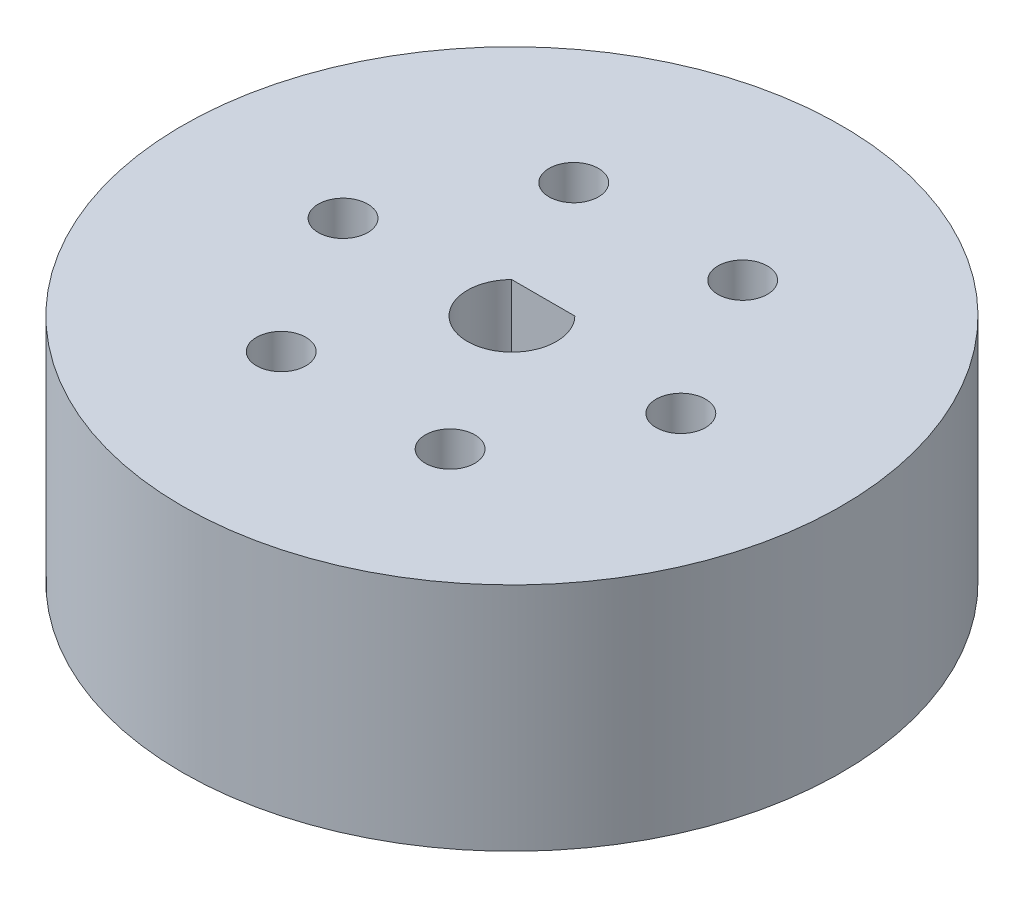
ISO-10303-21;
HEADER;
FILE_DESCRIPTION(('STEP AP214'),'2;1');
FILE_NAME('part.step','',(''),(''),'','','');
FILE_SCHEMA(('AUTOMOTIVE_DESIGN { 1 0 10303 214 1 1 1 1 }'));
ENDSEC;
DATA;
#1=APPLICATION_CONTEXT('core data for automotive mechanical design processes');
#2=APPLICATION_PROTOCOL_DEFINITION('international standard','automotive_design',2000,#1);
#3=PRODUCT_CONTEXT('',#1,'mechanical');
#4=PRODUCT('Part','Part','',(#3));
#5=PRODUCT_RELATED_PRODUCT_CATEGORY('part','',(#4));
#6=PRODUCT_DEFINITION_FORMATION('','',#4);
#7=PRODUCT_DEFINITION_CONTEXT('part definition',#1,'design');
#8=PRODUCT_DEFINITION('design','',#6,#7);
#9=PRODUCT_DEFINITION_SHAPE('','',#8);
#10=(LENGTH_UNIT() NAMED_UNIT(*) SI_UNIT(.MILLI.,.METRE.));
#11=(NAMED_UNIT(*) PLANE_ANGLE_UNIT() SI_UNIT($,.RADIAN.));
#12=(NAMED_UNIT(*) SI_UNIT($,.STERADIAN.) SOLID_ANGLE_UNIT());
#13=UNCERTAINTY_MEASURE_WITH_UNIT(LENGTH_MEASURE(1.E-05),#10,'distance_accuracy_value','');
#14=(GEOMETRIC_REPRESENTATION_CONTEXT(3) GLOBAL_UNCERTAINTY_ASSIGNED_CONTEXT((#13)) GLOBAL_UNIT_ASSIGNED_CONTEXT((#10,
#11,#12)) REPRESENTATION_CONTEXT('',''));
#15=CARTESIAN_POINT('',(0.,0.,0.));
#16=DIRECTION('',(0.,0.,1.));
#17=DIRECTION('',(1.,0.,0.));
#18=AXIS2_PLACEMENT_3D('',#15,#16,#17);
#19=CARTESIAN_POINT('',(0.0576965769122219,6.78723476658644,-19.9999167774521));
#20=DIRECTION('',(0.00288482884561109,0.,-0.999995838872608));
#21=DIRECTION('',(-0.999995838872608,0.,-0.00288482884561109));
#22=AXIS2_PLACEMENT_3D('',#19,#20,#21);
#23=CYLINDRICAL_SURFACE('',#22,1.2);
#24=CARTESIAN_POINT('',(0.00548119761462262,6.78723476658644,-1.9));
#25=DIRECTION('',(0.,0.,-1.));
#26=DIRECTION('',(1.,0.,0.));
#27=AXIS2_PLACEMENT_3D('',#24,#25,#26);
#28=ELLIPSE('',#27,1.20000499337364,1.2);
#29=CARTESIAN_POINT('',(1.20548619098827,6.78723476658644,-1.9));
#30=VERTEX_POINT('',#29);
#31=EDGE_CURVE('E90',#30,#30,#28,.T.);
#32=ORIENTED_EDGE('',*,*,#31,.F.);
#33=EDGE_LOOP('',(#32));
#34=FACE_BOUND('',#33,.T.);
#35=CARTESIAN_POINT('',(0.0493305732599497,6.78723476658644,-17.0999288447216));
#36=DIRECTION('',(0.00288482884561109,0.,-0.999995838872608));
#37=DIRECTION('',(-0.999995838872608,0.,-0.00288482884561109));
#38=AXIS2_PLACEMENT_3D('',#35,#36,#37);
#39=CIRCLE('',#38,1.2);
#40=CARTESIAN_POINT('',(-1.15066443338718,6.78723476658644,-17.1033906393363));
#41=VERTEX_POINT('',#40);
#42=EDGE_CURVE('E21',#41,#41,#39,.F.);
#43=ORIENTED_EDGE('',*,*,#42,.F.);
#44=EDGE_LOOP('',(#43));
#45=FACE_BOUND('',#44,.T.);
#46=ADVANCED_FACE('F16',(#34,#45),#23,.F.);
#47=CARTESIAN_POINT('',(0.,14.,0.));
#48=DIRECTION('',(0.,-1.,0.));
#49=DIRECTION('',(0.,0.,-1.));
#50=AXIS2_PLACEMENT_3D('',#47,#48,#49);
#51=CYLINDRICAL_SURFACE('',#50,20.);
#52=CARTESIAN_POINT('',(0.,8.98647806940963,-20.));
#53=CARTESIAN_POINT('',(-0.123176637815314,8.98324126856865,-19.9999984720124));
#54=CARTESIAN_POINT('',(-0.246161136773651,8.96962980992213,-19.9988500401782));
#55=CARTESIAN_POINT('',(-0.488170580767339,8.92201541306094,-19.9944088545781));
#56=CARTESIAN_POINT('',(-0.607191072317707,8.88799030547142,-19.9911137691959));
#57=CARTESIAN_POINT('',(-0.837741113813606,8.8005573294438,-19.9827798487453));
#58=CARTESIAN_POINT('',(-0.949275405178003,8.7471618692336,-19.9777421300658));
#59=CARTESIAN_POINT('',(-1.16178166002848,8.62252499791701,-19.9665120006754));
#60=CARTESIAN_POINT('',(-1.26275562933211,8.55128698456663,-19.9603198098679));
#61=CARTESIAN_POINT('',(-1.45173750911567,8.39265034647721,-19.9474679923171));
#62=CARTESIAN_POINT('',(-1.53969323348132,8.30518968509202,-19.940806634238));
#63=CARTESIAN_POINT('',(-1.69970397652202,8.11673749092767,-19.9278064057697));
#64=CARTESIAN_POINT('',(-1.77175828470953,8.01574535387562,-19.9214675498));
#65=CARTESIAN_POINT('',(-1.89805276035724,7.80283399716548,-19.9098327927493));
#66=CARTESIAN_POINT('',(-1.95225575014475,7.69089259486853,-19.9045390773718));
#67=CARTESIAN_POINT('',(-2.04106966132427,7.45942754987839,-19.8956286632006));
#68=CARTESIAN_POINT('',(-2.07568121200267,7.33990415085972,-19.8920119105428));
#69=CARTESIAN_POINT('',(-2.12418511044322,7.09723051434108,-19.8868910761321));
#70=CARTESIAN_POINT('',(-2.13816838461597,6.97409864796613,-19.8853777246145));
#71=CARTESIAN_POINT('',(-2.14529071340881,6.72722859001211,-19.8846106860781));
#72=CARTESIAN_POINT('',(-2.13843036834308,6.6034904159977,-19.885356933981));
#73=CARTESIAN_POINT('',(-2.10414065380669,6.35944407263588,-19.8890141003677));
#74=CARTESIAN_POINT('',(-2.07679441586095,6.23912407502109,-19.8919162697493));
#75=CARTESIAN_POINT('',(-2.002428574103,6.00478748846202,-19.8995393434844));
#76=CARTESIAN_POINT('',(-1.95540858881022,5.89077102179386,-19.9042602831043));
#77=CARTESIAN_POINT('',(-1.842892939196,5.67193340010251,-19.9149926662576));
#78=CARTESIAN_POINT('',(-1.77734826926518,5.56713761515502,-19.9210075225274));
#79=CARTESIAN_POINT('',(-1.62968741962193,5.36999443979788,-19.9336296960645));
#80=CARTESIAN_POINT('',(-1.54757066660879,5.27764748023185,-19.940237033824));
#81=CARTESIAN_POINT('',(-1.36858806031218,5.10752293923694,-19.9533215728868));
#82=CARTESIAN_POINT('',(-1.27164764646889,5.02982371139793,-19.9597979175918));
#83=CARTESIAN_POINT('',(-1.06605216755421,4.89179074208795,-19.9718331483426));
#84=CARTESIAN_POINT('',(-0.957397131568873,4.83145695750196,-19.9773920366664));
#85=CARTESIAN_POINT('',(-0.731471318351451,4.72990446203313,-19.9869386016669));
#86=CARTESIAN_POINT('',(-0.614203511575444,4.68867919634895,-19.9909268170614));
#87=CARTESIAN_POINT('',(-0.374358876645733,4.62652173046226,-19.9968556221667));
#88=CARTESIAN_POINT('',(-0.251782244621267,4.60558878124737,-19.9987962874551));
#89=CARTESIAN_POINT('',(-0.00549642226161848,4.5846911211898,-20.0003763056673));
#90=CARTESIAN_POINT('',(0.118203308739232,4.58461575072138,-20.0000278137824));
#91=CARTESIAN_POINT('',(0.363843166823541,4.60515759369319,-19.9970674706944));
#92=CARTESIAN_POINT('',(0.485783316608434,4.62577453992662,-19.9944556487185));
#93=CARTESIAN_POINT('',(0.724198831139169,4.68703212423651,-19.9872394531593));
#94=CARTESIAN_POINT('',(0.840684666693256,4.727632515295,-19.9826390867988));
#95=CARTESIAN_POINT('',(1.06519223783163,4.82766707807735,-19.9719305295676));
#96=CARTESIAN_POINT('',(1.17321372657139,4.88710179880929,-19.9658222947446));
#97=CARTESIAN_POINT('',(1.37824504006938,5.02342294847006,-19.9527204955877));
#98=CARTESIAN_POINT('',(1.47520450219815,5.10038475949606,-19.9457231665745));
#99=CARTESIAN_POINT('',(1.65486611286546,5.26945300034495,-19.9316220052691));
#100=CARTESIAN_POINT('',(1.73756785978576,5.36155985663809,-19.9245181699829));
#101=CARTESIAN_POINT('',(1.88670222011354,5.55875111552849,-19.9109517860557));
#102=CARTESIAN_POINT('',(1.95306804436796,5.66388623604518,-19.9044919322806));
#103=CARTESIAN_POINT('',(2.06719920762146,5.88388023172223,-19.8929634039619));
#104=CARTESIAN_POINT('',(2.11496491546465,5.99873891400737,-19.887894701832));
#105=CARTESIAN_POINT('',(2.19040806992656,6.23461125744848,-19.8797273468709));
#106=CARTESIAN_POINT('',(2.21813772259761,6.35560803726433,-19.8766235768373));
#107=CARTESIAN_POINT('',(2.25289355528498,6.60057447839338,-19.8727145225848));
#108=CARTESIAN_POINT('',(2.2599204422119,6.72454403805317,-19.8719091598853));
#109=CARTESIAN_POINT('',(2.25308180277748,6.97124746486024,-19.872685576501));
#110=CARTESIAN_POINT('',(2.23932510755617,7.09398440445057,-19.8742549209686));
#111=CARTESIAN_POINT('',(2.19152452999267,7.3353914710066,-19.8795822713429));
#112=CARTESIAN_POINT('',(2.15748055426112,7.45406157924861,-19.8833402873249));
#113=CARTESIAN_POINT('',(2.0700777625414,7.68403407868161,-19.8926292252966));
#114=CARTESIAN_POINT('',(2.01671185112524,7.79533374550528,-19.8981607984891));
#115=CARTESIAN_POINT('',(1.89218888758079,8.00741605877645,-19.9103872161883));
#116=CARTESIAN_POINT('',(1.82103179892871,8.10819868363276,-19.9170820630832));
#117=CARTESIAN_POINT('',(1.66249926336213,8.29695832206462,-19.9309418695528));
#118=CARTESIAN_POINT('',(1.57504028754395,8.38486502020656,-19.9381091215745));
#119=CARTESIAN_POINT('',(1.38657466018002,8.54479282572973,-19.9521006659551));
#120=CARTESIAN_POINT('',(1.28556483513483,8.61681020147998,-19.9589248774606));
#121=CARTESIAN_POINT('',(1.07258612974609,8.74304983314281,-19.971503670928));
#122=CARTESIAN_POINT('',(0.960590834432161,8.79722776105968,-19.9772555732418));
#123=CARTESIAN_POINT('',(0.729095364016713,8.8859276070843,-19.9870405005328));
#124=CARTESIAN_POINT('',(0.609603727649251,8.92047145378122,-19.9910754418497));
#125=CARTESIAN_POINT('',(0.407869124300898,8.96073067562828,-19.9960026474761));
#126=CARTESIAN_POINT('',(0.326752436999344,8.97225173144996,-19.997496778309));
#127=CARTESIAN_POINT('',(0.163728903167864,8.98620045171046,-19.9994959593343));
#128=CARTESIAN_POINT('',(0.0818220610052402,8.98862816638069,-20.0000010149903));
#129=CARTESIAN_POINT('',(0.,8.98647806940963,-20.));
#130=B_SPLINE_CURVE_WITH_KNOTS('',3,(#52,#53,#54,#55,#56,#57,#58,#59,#60,#61,#62,#63,#64,#65,
#66,#67,#68,#69,#70,#71,#72,#73,#74,#75,#76,#77,#78,#79,#80,#81,#82,#83,#84,#85,#86,#87,#88,#89,
#90,#91,#92,#93,#94,#95,#96,#97,#98,#99,#100,#101,#102,#103,#104,#105,#106,#107,#108,#109,#110,
#111,#112,#113,#114,#115,#116,#117,#118,#119,#120,#121,#122,#123,#124,#125,#126,#127,#128,#129),
.UNSPECIFIED.,.T.,.F.,(4,2,2,2,2,2,2,2,2,2,2,2,2,2,2,2,2,2,2,2,2,2,2,2,2,2,2,2,2,2,2,2,2,2,2,2,
2,2,4),(0.,0.369358399558057,0.739118653029371,1.10864246314059,1.47809595829202,
1.84899254269643,2.21990569569267,2.59158650899803,2.96325538306017,3.33328104884391,
3.70329605767084,4.0718176286514,4.44034634572002,4.80985925178704,5.17938494311059,
5.55083444656259,5.9222830277698,6.29360409638182,6.66491145859063,7.03424881621686,
7.40358140452763,7.77217317542836,8.14077569152068,8.51099451181307,8.88122375890573,
9.25294243695045,9.62465374336212,9.99539298944654,10.3661195762299,10.7349116074727,
11.1037053364059,11.4726346318696,11.8415646847201,12.212439819284,12.5834019619288,
12.9552790460346,13.3267399739135,13.5720935814028,13.8174458335625),.UNSPECIFIED.);
#131=CARTESIAN_POINT('',(0.,8.98647806940963,-20.));
#132=VERTEX_POINT('',#131);
#133=EDGE_CURVE('E10',#132,#132,#130,.T.);
#134=ORIENTED_EDGE('',*,*,#133,.T.);
#135=EDGE_LOOP('',(#134));
#136=FACE_BOUND('',#135,.T.);
#137=CARTESIAN_POINT('',(0.,14.,0.));
#138=DIRECTION('',(0.,1.,0.));
#139=DIRECTION('',(0.,0.,1.));
#140=AXIS2_PLACEMENT_3D('',#137,#138,#139);
#141=CIRCLE('',#140,20.);
#142=CARTESIAN_POINT('',(0.,14.,20.));
#143=VERTEX_POINT('',#142);
#144=EDGE_CURVE('E27',#143,#143,#141,.T.);
#145=ORIENTED_EDGE('',*,*,#144,.F.);
#146=EDGE_LOOP('',(#145));
#147=FACE_BOUND('',#146,.T.);
#148=CARTESIAN_POINT('',(0.,0.,0.));
#149=DIRECTION('',(0.,1.,0.));
#150=DIRECTION('',(0.,0.,1.));
#151=AXIS2_PLACEMENT_3D('',#148,#149,#150);
#152=CIRCLE('',#151,20.);
#153=CARTESIAN_POINT('',(0.,0.,20.));
#154=VERTEX_POINT('',#153);
#155=EDGE_CURVE('E142',#154,#154,#152,.T.);
#156=ORIENTED_EDGE('',*,*,#155,.T.);
#157=EDGE_LOOP('',(#156));
#158=FACE_BOUND('',#157,.T.);
#159=ADVANCED_FACE('F18',(#136,#147,#158),#51,.T.);
#160=CARTESIAN_POINT('',(0.,14.,0.));
#161=DIRECTION('',(0.,1.,0.));
#162=DIRECTION('',(0.,0.,1.));
#163=AXIS2_PLACEMENT_3D('',#160,#161,#162);
#164=PLANE('',#163);
#165=CARTESIAN_POINT('',(0.,14.,0.));
#166=DIRECTION('',(0.,1.,0.));
#167=DIRECTION('',(0.,0.,1.));
#168=AXIS2_PLACEMENT_3D('',#165,#166,#167);
#169=CIRCLE('',#168,2.7);
#170=CARTESIAN_POINT('',(-1.91833260932509,14.,-1.9));
#171=VERTEX_POINT('',#170);
#172=CARTESIAN_POINT('',(1.91833260932509,14.,-1.9));
#173=VERTEX_POINT('',#172);
#174=EDGE_CURVE('E35',#171,#173,#169,.T.);
#175=ORIENTED_EDGE('',*,*,#174,.F.);
#176=DIRECTION('',(-1.,0.,0.));
#177=VECTOR('',#176,1.);
#178=CARTESIAN_POINT('',(-1.91833260932509,14.,-1.9));
#179=LINE('',#178,#177);
#180=EDGE_CURVE('E81',#173,#171,#179,.T.);
#181=ORIENTED_EDGE('',*,*,#180,.F.);
#182=EDGE_LOOP('',(#175,#181));
#183=FACE_BOUND('',#182,.T.);
#184=CARTESIAN_POINT('',(-10.25,14.,0.));
#185=DIRECTION('',(0.,1.,0.));
#186=DIRECTION('',(0.,0.,1.));
#187=AXIS2_PLACEMENT_3D('',#184,#185,#186);
#188=CIRCLE('',#187,1.5);
#189=CARTESIAN_POINT('',(-10.25,14.,1.5));
#190=VERTEX_POINT('',#189);
#191=EDGE_CURVE('E93',#190,#190,#188,.T.);
#192=ORIENTED_EDGE('',*,*,#191,.F.);
#193=EDGE_LOOP('',(#192));
#194=FACE_BOUND('',#193,.T.);
#195=CARTESIAN_POINT('',(-5.125,14.,-8.87676038879051));
#196=DIRECTION('',(0.,1.,0.));
#197=DIRECTION('',(0.,0.,1.));
#198=AXIS2_PLACEMENT_3D('',#195,#196,#197);
#199=CIRCLE('',#198,1.5);
#200=CARTESIAN_POINT('',(-5.125,14.,-7.37676038879051));
#201=VERTEX_POINT('',#200);
#202=EDGE_CURVE('E102',#201,#201,#199,.T.);
#203=ORIENTED_EDGE('',*,*,#202,.F.);
#204=EDGE_LOOP('',(#203));
#205=FACE_BOUND('',#204,.T.);
#206=CARTESIAN_POINT('',(5.125,14.,-8.87676038879048));
#207=DIRECTION('',(0.,1.,0.));
#208=DIRECTION('',(0.,0.,1.));
#209=AXIS2_PLACEMENT_3D('',#206,#207,#208);
#210=CIRCLE('',#209,1.5);
#211=CARTESIAN_POINT('',(5.125,14.,-7.37676038879048));
#212=VERTEX_POINT('',#211);
#213=EDGE_CURVE('E110',#212,#212,#210,.T.);
#214=ORIENTED_EDGE('',*,*,#213,.F.);
#215=EDGE_LOOP('',(#214));
#216=FACE_BOUND('',#215,.T.);
#217=CARTESIAN_POINT('',(10.25,14.,0.));
#218=DIRECTION('',(0.,1.,0.));
#219=DIRECTION('',(0.,0.,1.));
#220=AXIS2_PLACEMENT_3D('',#217,#218,#219);
#221=CIRCLE('',#220,1.5);
#222=CARTESIAN_POINT('',(10.25,14.,1.50000000000007));
#223=VERTEX_POINT('',#222);
#224=EDGE_CURVE('E118',#223,#223,#221,.T.);
#225=ORIENTED_EDGE('',*,*,#224,.F.);
#226=EDGE_LOOP('',(#225));
#227=FACE_BOUND('',#226,.T.);
#228=CARTESIAN_POINT('',(5.12499999999992,14.,8.87676038879054));
#229=DIRECTION('',(0.,1.,0.));
#230=DIRECTION('',(0.,0.,1.));
#231=AXIS2_PLACEMENT_3D('',#228,#229,#230);
#232=CIRCLE('',#231,1.5);
#233=CARTESIAN_POINT('',(5.12499999999992,14.,10.3767603887905));
#234=VERTEX_POINT('',#233);
#235=EDGE_CURVE('E126',#234,#234,#232,.T.);
#236=ORIENTED_EDGE('',*,*,#235,.F.);
#237=EDGE_LOOP('',(#236));
#238=FACE_BOUND('',#237,.T.);
#239=CARTESIAN_POINT('',(-5.1250000000001,14.,8.87676038879044));
#240=DIRECTION('',(0.,1.,0.));
#241=DIRECTION('',(0.,0.,1.));
#242=AXIS2_PLACEMENT_3D('',#239,#240,#241);
#243=CIRCLE('',#242,1.5);
#244=CARTESIAN_POINT('',(-5.1250000000001,14.,10.3767603887904));
#245=VERTEX_POINT('',#244);
#246=EDGE_CURVE('E134',#245,#245,#243,.T.);
#247=ORIENTED_EDGE('',*,*,#246,.F.);
#248=EDGE_LOOP('',(#247));
#249=FACE_BOUND('',#248,.T.);
#250=ORIENTED_EDGE('',*,*,#144,.T.);
#251=EDGE_LOOP('',(#250));
#252=FACE_BOUND('',#251,.T.);
#253=ADVANCED_FACE('F215',(#183,#194,#205,#216,#227,#238,#249,#252),#164,.T.);
#254=CARTESIAN_POINT('',(0.,0.,0.));
#255=DIRECTION('',(0.,1.,0.));
#256=DIRECTION('',(0.,0.,1.));
#257=AXIS2_PLACEMENT_3D('',#254,#255,#256);
#258=PLANE('',#257);
#259=DIRECTION('',(-1.,0.,0.));
#260=VECTOR('',#259,1.);
#261=CARTESIAN_POINT('',(-1.91833260932509,0.,-1.9));
#262=LINE('',#261,#260);
#263=CARTESIAN_POINT('',(1.91833260932509,0.,-1.9));
#264=VERTEX_POINT('',#263);
#265=CARTESIAN_POINT('',(-1.91833260932509,0.,-1.9));
#266=VERTEX_POINT('',#265);
#267=EDGE_CURVE('E71',#264,#266,#262,.T.);
#268=ORIENTED_EDGE('',*,*,#267,.T.);
#269=CARTESIAN_POINT('',(0.,0.,0.));
#270=DIRECTION('',(0.,1.,0.));
#271=DIRECTION('',(0.,0.,1.));
#272=AXIS2_PLACEMENT_3D('',#269,#270,#271);
#273=CIRCLE('',#272,2.7);
#274=EDGE_CURVE('E40',#266,#264,#273,.T.);
#275=ORIENTED_EDGE('',*,*,#274,.T.);
#276=EDGE_LOOP('',(#268,#275));
#277=FACE_BOUND('',#276,.T.);
#278=ORIENTED_EDGE('',*,*,#155,.F.);
#279=EDGE_LOOP('',(#278));
#280=FACE_BOUND('',#279,.T.);
#281=ADVANCED_FACE('F78',(#277,#280),#258,.F.);
#282=CARTESIAN_POINT('',(-5.1250000000001,4.,8.87676038879044));
#283=DIRECTION('',(0.,1.,0.));
#284=DIRECTION('',(0.,0.,1.));
#285=AXIS2_PLACEMENT_3D('',#282,#283,#284);
#286=CONICAL_SURFACE('',#285,1.5,1.02974425867665);
#287=CARTESIAN_POINT('',(-5.12500000000011,3.09870907145866,8.87676038879044));
#288=VERTEX_POINT('',#287);
#289=VERTEX_LOOP('',#288);
#290=FACE_BOUND('',#289,.T.);
#291=CARTESIAN_POINT('',(-5.1250000000001,4.,8.87676038879044));
#292=DIRECTION('',(0.,1.,0.));
#293=DIRECTION('',(0.,0.,1.));
#294=AXIS2_PLACEMENT_3D('',#291,#292,#293);
#295=CIRCLE('',#294,1.5);
#296=CARTESIAN_POINT('',(-5.1250000000001,4.,10.3767603887904));
#297=VERTEX_POINT('',#296);
#298=EDGE_CURVE('E138',#297,#297,#295,.T.);
#299=ORIENTED_EDGE('',*,*,#298,.T.);
#300=EDGE_LOOP('',(#299));
#301=FACE_BOUND('',#300,.T.);
#302=ADVANCED_FACE('F210',(#290,#301),#286,.F.);
#303=CARTESIAN_POINT('',(-5.1250000000001,14.,8.87676038879044));
#304=DIRECTION('',(0.,1.,0.));
#305=DIRECTION('',(0.,0.,1.));
#306=AXIS2_PLACEMENT_3D('',#303,#304,#305);
#307=CYLINDRICAL_SURFACE('',#306,1.5);
#308=ORIENTED_EDGE('',*,*,#298,.F.);
#309=EDGE_LOOP('',(#308));
#310=FACE_BOUND('',#309,.T.);
#311=ORIENTED_EDGE('',*,*,#246,.T.);
#312=EDGE_LOOP('',(#311));
#313=FACE_BOUND('',#312,.T.);
#314=ADVANCED_FACE('F206',(#310,#313),#307,.F.);
#315=CARTESIAN_POINT('',(5.12499999999992,4.,8.87676038879054));
#316=DIRECTION('',(0.,1.,0.));
#317=DIRECTION('',(0.,0.,1.));
#318=AXIS2_PLACEMENT_3D('',#315,#316,#317);
#319=CONICAL_SURFACE('',#318,1.5,1.02974425867665);
#320=CARTESIAN_POINT('',(5.12499999999992,3.09870907145866,8.87676038879054));
#321=VERTEX_POINT('',#320);
#322=VERTEX_LOOP('',#321);
#323=FACE_BOUND('',#322,.T.);
#324=CARTESIAN_POINT('',(5.12499999999992,4.,8.87676038879054));
#325=DIRECTION('',(0.,1.,0.));
#326=DIRECTION('',(0.,0.,1.));
#327=AXIS2_PLACEMENT_3D('',#324,#325,#326);
#328=CIRCLE('',#327,1.5);
#329=CARTESIAN_POINT('',(5.12499999999992,4.,10.3767603887905));
#330=VERTEX_POINT('',#329);
#331=EDGE_CURVE('E130',#330,#330,#328,.T.);
#332=ORIENTED_EDGE('',*,*,#331,.T.);
#333=EDGE_LOOP('',(#332));
#334=FACE_BOUND('',#333,.T.);
#335=ADVANCED_FACE('F202',(#323,#334),#319,.F.);
#336=CARTESIAN_POINT('',(5.12499999999992,14.,8.87676038879054));
#337=DIRECTION('',(0.,1.,0.));
#338=DIRECTION('',(0.,0.,1.));
#339=AXIS2_PLACEMENT_3D('',#336,#337,#338);
#340=CYLINDRICAL_SURFACE('',#339,1.5);
#341=ORIENTED_EDGE('',*,*,#331,.F.);
#342=EDGE_LOOP('',(#341));
#343=FACE_BOUND('',#342,.T.);
#344=ORIENTED_EDGE('',*,*,#235,.T.);
#345=EDGE_LOOP('',(#344));
#346=FACE_BOUND('',#345,.T.);
#347=ADVANCED_FACE('F198',(#343,#346),#340,.F.);
#348=CARTESIAN_POINT('',(10.25,4.,0.));
#349=DIRECTION('',(0.,1.,0.));
#350=DIRECTION('',(0.,0.,1.));
#351=AXIS2_PLACEMENT_3D('',#348,#349,#350);
#352=CONICAL_SURFACE('',#351,1.5,1.02974425867665);
#353=CARTESIAN_POINT('',(10.25,3.09870907145866,0.));
#354=VERTEX_POINT('',#353);
#355=VERTEX_LOOP('',#354);
#356=FACE_BOUND('',#355,.T.);
#357=CARTESIAN_POINT('',(10.25,4.,0.));
#358=DIRECTION('',(0.,1.,0.));
#359=DIRECTION('',(0.,0.,1.));
#360=AXIS2_PLACEMENT_3D('',#357,#358,#359);
#361=CIRCLE('',#360,1.5);
#362=CARTESIAN_POINT('',(10.25,4.,1.50000000000007));
#363=VERTEX_POINT('',#362);
#364=EDGE_CURVE('E122',#363,#363,#361,.T.);
#365=ORIENTED_EDGE('',*,*,#364,.T.);
#366=EDGE_LOOP('',(#365));
#367=FACE_BOUND('',#366,.T.);
#368=ADVANCED_FACE('F194',(#356,#367),#352,.F.);
#369=CARTESIAN_POINT('',(10.25,14.,0.));
#370=DIRECTION('',(0.,1.,0.));
#371=DIRECTION('',(0.,0.,1.));
#372=AXIS2_PLACEMENT_3D('',#369,#370,#371);
#373=CYLINDRICAL_SURFACE('',#372,1.5);
#374=ORIENTED_EDGE('',*,*,#364,.F.);
#375=EDGE_LOOP('',(#374));
#376=FACE_BOUND('',#375,.T.);
#377=ORIENTED_EDGE('',*,*,#224,.T.);
#378=EDGE_LOOP('',(#377));
#379=FACE_BOUND('',#378,.T.);
#380=ADVANCED_FACE('F190',(#376,#379),#373,.F.);
#381=CARTESIAN_POINT('',(5.125,4.,-8.87676038879048));
#382=DIRECTION('',(0.,1.,0.));
#383=DIRECTION('',(0.,0.,1.));
#384=AXIS2_PLACEMENT_3D('',#381,#382,#383);
#385=CONICAL_SURFACE('',#384,1.5,1.02974425867665);
#386=CARTESIAN_POINT('',(5.125,3.09870907145866,-8.87676038879048));
#387=VERTEX_POINT('',#386);
#388=VERTEX_LOOP('',#387);
#389=FACE_BOUND('',#388,.T.);
#390=CARTESIAN_POINT('',(5.125,4.,-8.87676038879048));
#391=DIRECTION('',(0.,1.,0.));
#392=DIRECTION('',(0.,0.,1.));
#393=AXIS2_PLACEMENT_3D('',#390,#391,#392);
#394=CIRCLE('',#393,1.5);
#395=CARTESIAN_POINT('',(5.125,4.,-7.37676038879048));
#396=VERTEX_POINT('',#395);
#397=EDGE_CURVE('E114',#396,#396,#394,.T.);
#398=ORIENTED_EDGE('',*,*,#397,.T.);
#399=EDGE_LOOP('',(#398));
#400=FACE_BOUND('',#399,.T.);
#401=ADVANCED_FACE('F186',(#389,#400),#385,.F.);
#402=CARTESIAN_POINT('',(5.125,14.,-8.87676038879048));
#403=DIRECTION('',(0.,1.,0.));
#404=DIRECTION('',(0.,0.,1.));
#405=AXIS2_PLACEMENT_3D('',#402,#403,#404);
#406=CYLINDRICAL_SURFACE('',#405,1.5);
#407=ORIENTED_EDGE('',*,*,#397,.F.);
#408=EDGE_LOOP('',(#407));
#409=FACE_BOUND('',#408,.T.);
#410=ORIENTED_EDGE('',*,*,#213,.T.);
#411=EDGE_LOOP('',(#410));
#412=FACE_BOUND('',#411,.T.);
#413=ADVANCED_FACE('F182',(#409,#412),#406,.F.);
#414=CARTESIAN_POINT('',(-5.125,4.,-8.87676038879051));
#415=DIRECTION('',(0.,1.,0.));
#416=DIRECTION('',(0.,0.,1.));
#417=AXIS2_PLACEMENT_3D('',#414,#415,#416);
#418=CONICAL_SURFACE('',#417,1.5,1.02974425867665);
#419=CARTESIAN_POINT('',(-5.125,3.09870907145866,-8.87676038879051));
#420=VERTEX_POINT('',#419);
#421=VERTEX_LOOP('',#420);
#422=FACE_BOUND('',#421,.T.);
#423=CARTESIAN_POINT('',(-5.125,4.,-8.87676038879051));
#424=DIRECTION('',(0.,1.,0.));
#425=DIRECTION('',(0.,0.,1.));
#426=AXIS2_PLACEMENT_3D('',#423,#424,#425);
#427=CIRCLE('',#426,1.5);
#428=CARTESIAN_POINT('',(-5.125,4.,-7.37676038879051));
#429=VERTEX_POINT('',#428);
#430=EDGE_CURVE('E106',#429,#429,#427,.T.);
#431=ORIENTED_EDGE('',*,*,#430,.T.);
#432=EDGE_LOOP('',(#431));
#433=FACE_BOUND('',#432,.T.);
#434=ADVANCED_FACE('F178',(#422,#433),#418,.F.);
#435=CARTESIAN_POINT('',(-5.125,14.,-8.87676038879051));
#436=DIRECTION('',(0.,1.,0.));
#437=DIRECTION('',(0.,0.,1.));
#438=AXIS2_PLACEMENT_3D('',#435,#436,#437);
#439=CYLINDRICAL_SURFACE('',#438,1.5);
#440=ORIENTED_EDGE('',*,*,#430,.F.);
#441=EDGE_LOOP('',(#440));
#442=FACE_BOUND('',#441,.T.);
#443=ORIENTED_EDGE('',*,*,#202,.T.);
#444=EDGE_LOOP('',(#443));
#445=FACE_BOUND('',#444,.T.);
#446=ADVANCED_FACE('F174',(#442,#445),#439,.F.);
#447=CARTESIAN_POINT('',(-10.25,4.,0.));
#448=DIRECTION('',(0.,1.,0.));
#449=DIRECTION('',(0.,0.,1.));
#450=AXIS2_PLACEMENT_3D('',#447,#448,#449);
#451=CONICAL_SURFACE('',#450,1.5,1.02974425867665);
#452=CARTESIAN_POINT('',(-10.25,3.09870907145866,0.));
#453=VERTEX_POINT('',#452);
#454=VERTEX_LOOP('',#453);
#455=FACE_BOUND('',#454,.T.);
#456=CARTESIAN_POINT('',(-10.25,4.,0.));
#457=DIRECTION('',(0.,1.,0.));
#458=DIRECTION('',(0.,0.,1.));
#459=AXIS2_PLACEMENT_3D('',#456,#457,#458);
#460=CIRCLE('',#459,1.5);
#461=CARTESIAN_POINT('',(-10.25,4.,1.5));
#462=VERTEX_POINT('',#461);
#463=EDGE_CURVE('E98',#462,#462,#460,.T.);
#464=ORIENTED_EDGE('',*,*,#463,.T.);
#465=EDGE_LOOP('',(#464));
#466=FACE_BOUND('',#465,.T.);
#467=ADVANCED_FACE('F170',(#455,#466),#451,.F.);
#468=CARTESIAN_POINT('',(-10.25,14.,0.));
#469=DIRECTION('',(0.,1.,0.));
#470=DIRECTION('',(0.,0.,1.));
#471=AXIS2_PLACEMENT_3D('',#468,#469,#470);
#472=CYLINDRICAL_SURFACE('',#471,1.5);
#473=ORIENTED_EDGE('',*,*,#463,.F.);
#474=EDGE_LOOP('',(#473));
#475=FACE_BOUND('',#474,.T.);
#476=ORIENTED_EDGE('',*,*,#191,.T.);
#477=EDGE_LOOP('',(#476));
#478=FACE_BOUND('',#477,.T.);
#479=ADVANCED_FACE('F167',(#475,#478),#472,.F.);
#480=CARTESIAN_POINT('',(0.,0.,0.));
#481=DIRECTION('',(0.,1.,0.));
#482=DIRECTION('',(0.,0.,1.));
#483=AXIS2_PLACEMENT_3D('',#480,#481,#482);
#484=CYLINDRICAL_SURFACE('',#483,2.7);
#485=ORIENTED_EDGE('',*,*,#174,.T.);
#486=DIRECTION('',(0.,1.,0.));
#487=VECTOR('',#486,1.);
#488=CARTESIAN_POINT('',(1.91833260932509,0.,-1.9));
#489=LINE('',#488,#487);
#490=EDGE_CURVE('E63',#264,#173,#489,.T.);
#491=ORIENTED_EDGE('',*,*,#490,.F.);
#492=ORIENTED_EDGE('',*,*,#274,.F.);
#493=DIRECTION('',(0.,1.,0.));
#494=VECTOR('',#493,1.);
#495=CARTESIAN_POINT('',(-1.91833260932509,0.,-1.9));
#496=LINE('',#495,#494);
#497=EDGE_CURVE('E70',#266,#171,#496,.T.);
#498=ORIENTED_EDGE('',*,*,#497,.T.);
#499=EDGE_LOOP('',(#485,#491,#492,#498));
#500=FACE_BOUND('',#499,.T.);
#501=ADVANCED_FACE('F65',(#500),#484,.F.);
#502=CARTESIAN_POINT('',(-1.91833260932509,0.,-1.9));
#503=DIRECTION('',(0.,0.,-1.));
#504=DIRECTION('',(-1.,0.,0.));
#505=AXIS2_PLACEMENT_3D('',#502,#503,#504);
#506=PLANE('',#505);
#507=ORIENTED_EDGE('',*,*,#31,.T.);
#508=EDGE_LOOP('',(#507));
#509=FACE_BOUND('',#508,.T.);
#510=ORIENTED_EDGE('',*,*,#180,.T.);
#511=ORIENTED_EDGE('',*,*,#497,.F.);
#512=ORIENTED_EDGE('',*,*,#267,.F.);
#513=ORIENTED_EDGE('',*,*,#490,.T.);
#514=EDGE_LOOP('',(#510,#511,#512,#513));
#515=FACE_BOUND('',#514,.T.);
#516=ADVANCED_FACE('F74',(#509,#515),#506,.F.);
#517=CARTESIAN_POINT('',(0.0576965769122219,6.78723476658644,-19.9999167774521));
#518=DIRECTION('',(0.00288482884561109,0.,-0.999995838872608));
#519=DIRECTION('',(-0.999995838872608,0.,-0.00288482884561109));
#520=AXIS2_PLACEMENT_3D('',#517,#518,#519);
#521=CYLINDRICAL_SURFACE('',#520,2.2);
#522=ORIENTED_EDGE('',*,*,#133,.F.);
#523=EDGE_LOOP('',(#522));
#524=FACE_BOUND('',#523,.T.);
#525=CARTESIAN_POINT('',(0.0493305732599497,6.78723476658644,-17.0999288447216));
#526=DIRECTION('',(0.00288482884561109,0.,-0.999995838872608));
#527=DIRECTION('',(-0.999995838872608,0.,-0.00288482884561109));
#528=AXIS2_PLACEMENT_3D('',#525,#526,#527);
#529=CIRCLE('',#528,2.2);
#530=CARTESIAN_POINT('',(-2.15066027225979,6.78723476658644,-17.1062754681819));
#531=VERTEX_POINT('',#530);
#532=EDGE_CURVE('E87',#531,#531,#529,.T.);
#533=ORIENTED_EDGE('',*,*,#532,.F.);
#534=EDGE_LOOP('',(#533));
#535=FACE_BOUND('',#534,.T.);
#536=ADVANCED_FACE('F152',(#524,#535),#521,.F.);
#537=CARTESIAN_POINT('',(0.0493305732599497,6.78723476658644,-17.0999288447216));
#538=DIRECTION('',(0.00288482884561109,0.,-0.999995838872608));
#539=DIRECTION('',(-0.999995838872608,0.,-0.00288482884561109));
#540=AXIS2_PLACEMENT_3D('',#537,#538,#539);
#541=PLANE('',#540);
#542=ORIENTED_EDGE('',*,*,#532,.T.);
#543=EDGE_LOOP('',(#542));
#544=FACE_BOUND('',#543,.T.);
#545=ORIENTED_EDGE('',*,*,#42,.T.);
#546=EDGE_LOOP('',(#545));
#547=FACE_BOUND('',#546,.T.);
#548=ADVANCED_FACE('F157',(#544,#547),#541,.T.);
#549=CLOSED_SHELL('',(#46,#159,#253,#281,#302,#314,#335,#347,#368,#380,#401,#413,#434,#446,#467,
#479,#501,#516,#536,#548));
#550=MANIFOLD_SOLID_BREP('B1',#549);
#551=ADVANCED_BREP_SHAPE_REPRESENTATION('',(#18,#550),#14);
#552=SHAPE_DEFINITION_REPRESENTATION(#9,#551);
ENDSEC;
END-ISO-10303-21;
